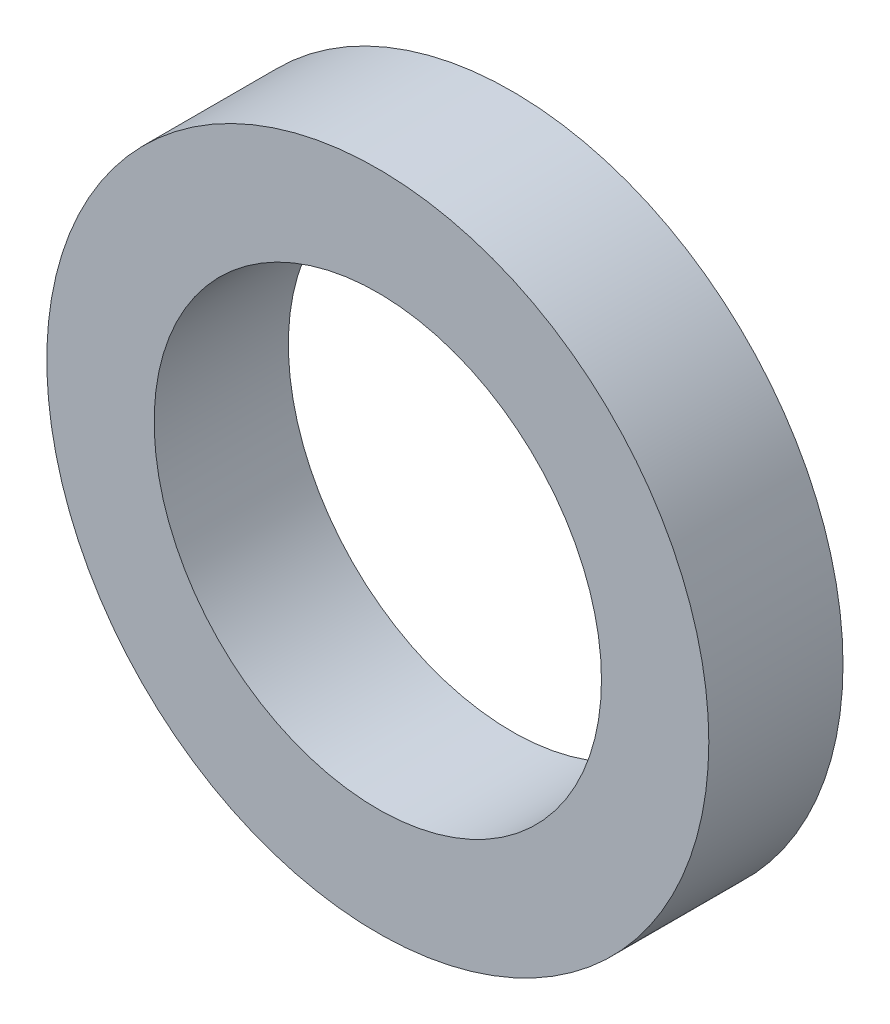
ISO-10303-21;
HEADER;
FILE_DESCRIPTION(('STEP AP214'),'2;1');
FILE_NAME('part.step','',(''),(''),'','','');
FILE_SCHEMA(('AUTOMOTIVE_DESIGN { 1 0 10303 214 1 1 1 1 }'));
ENDSEC;
DATA;
#1=APPLICATION_CONTEXT('core data for automotive mechanical design processes');
#2=APPLICATION_PROTOCOL_DEFINITION('international standard','automotive_design',2000,#1);
#3=PRODUCT_CONTEXT('',#1,'mechanical');
#4=PRODUCT('Part','Part','',(#3));
#5=PRODUCT_RELATED_PRODUCT_CATEGORY('part','',(#4));
#6=PRODUCT_DEFINITION_FORMATION('','',#4);
#7=PRODUCT_DEFINITION_CONTEXT('part definition',#1,'design');
#8=PRODUCT_DEFINITION('design','',#6,#7);
#9=PRODUCT_DEFINITION_SHAPE('','',#8);
#10=(LENGTH_UNIT() NAMED_UNIT(*) SI_UNIT(.MILLI.,.METRE.));
#11=(NAMED_UNIT(*) PLANE_ANGLE_UNIT() SI_UNIT($,.RADIAN.));
#12=(NAMED_UNIT(*) SI_UNIT($,.STERADIAN.) SOLID_ANGLE_UNIT());
#13=UNCERTAINTY_MEASURE_WITH_UNIT(LENGTH_MEASURE(1.E-05),#10,'distance_accuracy_value','');
#14=(GEOMETRIC_REPRESENTATION_CONTEXT(3) GLOBAL_UNCERTAINTY_ASSIGNED_CONTEXT((#13)) GLOBAL_UNIT_ASSIGNED_CONTEXT((#10,
#11,#12)) REPRESENTATION_CONTEXT('',''));
#15=CARTESIAN_POINT('',(0.,0.,0.));
#16=DIRECTION('',(0.,0.,1.));
#17=DIRECTION('',(1.,0.,0.));
#18=AXIS2_PLACEMENT_3D('',#15,#16,#17);
#19=CARTESIAN_POINT('',(0.,0.,1.5));
#20=DIRECTION('',(0.,0.,1.));
#21=DIRECTION('',(1.,0.,0.));
#22=AXIS2_PLACEMENT_3D('',#19,#20,#21);
#23=PLANE('',#22);
#24=CARTESIAN_POINT('',(0.,0.,1.5));
#25=DIRECTION('',(0.,0.,1.));
#26=DIRECTION('',(1.,0.,0.));
#27=AXIS2_PLACEMENT_3D('',#24,#25,#26);
#28=CIRCLE('',#27,3.7);
#29=CARTESIAN_POINT('',(3.7,0.,1.5));
#30=VERTEX_POINT('',#29);
#31=EDGE_CURVE('E10',#30,#30,#28,.T.);
#32=ORIENTED_EDGE('',*,*,#31,.T.);
#33=EDGE_LOOP('',(#32));
#34=FACE_BOUND('',#33,.T.);
#35=CARTESIAN_POINT('',(0.,0.,1.5));
#36=DIRECTION('',(0.,0.,1.));
#37=DIRECTION('',(1.,0.,0.));
#38=AXIS2_PLACEMENT_3D('',#35,#36,#37);
#39=CIRCLE('',#38,2.5);
#40=CARTESIAN_POINT('',(2.5,0.,1.5));
#41=VERTEX_POINT('',#40);
#42=EDGE_CURVE('E54',#41,#41,#39,.T.);
#43=ORIENTED_EDGE('',*,*,#42,.F.);
#44=EDGE_LOOP('',(#43));
#45=FACE_BOUND('',#44,.T.);
#46=ADVANCED_FACE('F41',(#34,#45),#23,.T.);
#47=CARTESIAN_POINT('',(0.,0.,0.));
#48=DIRECTION('',(0.,0.,1.));
#49=DIRECTION('',(1.,0.,0.));
#50=AXIS2_PLACEMENT_3D('',#47,#48,#49);
#51=PLANE('',#50);
#52=CARTESIAN_POINT('',(0.,0.,0.));
#53=DIRECTION('',(0.,0.,1.));
#54=DIRECTION('',(1.,0.,0.));
#55=AXIS2_PLACEMENT_3D('',#52,#53,#54);
#56=CIRCLE('',#55,3.7);
#57=CARTESIAN_POINT('',(3.7,0.,0.));
#58=VERTEX_POINT('',#57);
#59=EDGE_CURVE('E45',#58,#58,#56,.T.);
#60=ORIENTED_EDGE('',*,*,#59,.F.);
#61=EDGE_LOOP('',(#60));
#62=FACE_BOUND('',#61,.T.);
#63=CARTESIAN_POINT('',(0.,0.,0.));
#64=DIRECTION('',(0.,0.,1.));
#65=DIRECTION('',(1.,0.,0.));
#66=AXIS2_PLACEMENT_3D('',#63,#64,#65);
#67=CIRCLE('',#66,2.5);
#68=CARTESIAN_POINT('',(2.5,0.,0.));
#69=VERTEX_POINT('',#68);
#70=EDGE_CURVE('E56',#69,#69,#67,.T.);
#71=ORIENTED_EDGE('',*,*,#70,.T.);
#72=EDGE_LOOP('',(#71));
#73=FACE_BOUND('',#72,.T.);
#74=ADVANCED_FACE('F68',(#62,#73),#51,.F.);
#75=CARTESIAN_POINT('',(0.,0.,1.5));
#76=DIRECTION('',(0.,0.,-1.));
#77=DIRECTION('',(-1.,0.,0.));
#78=AXIS2_PLACEMENT_3D('',#75,#76,#77);
#79=CYLINDRICAL_SURFACE('',#78,3.7);
#80=ORIENTED_EDGE('',*,*,#31,.F.);
#81=EDGE_LOOP('',(#80));
#82=FACE_BOUND('',#81,.T.);
#83=ORIENTED_EDGE('',*,*,#59,.T.);
#84=EDGE_LOOP('',(#83));
#85=FACE_BOUND('',#84,.T.);
#86=ADVANCED_FACE('F43',(#82,#85),#79,.T.);
#87=CARTESIAN_POINT('',(0.,0.,1.5));
#88=DIRECTION('',(0.,0.,-1.));
#89=DIRECTION('',(-1.,0.,0.));
#90=AXIS2_PLACEMENT_3D('',#87,#88,#89);
#91=CYLINDRICAL_SURFACE('',#90,2.5);
#92=ORIENTED_EDGE('',*,*,#42,.T.);
#93=EDGE_LOOP('',(#92));
#94=FACE_BOUND('',#93,.T.);
#95=ORIENTED_EDGE('',*,*,#70,.F.);
#96=EDGE_LOOP('',(#95));
#97=FACE_BOUND('',#96,.T.);
#98=ADVANCED_FACE('F64',(#94,#97),#91,.F.);
#99=CLOSED_SHELL('',(#46,#74,#86,#98));
#100=MANIFOLD_SOLID_BREP('B2',#99);
#101=ADVANCED_BREP_SHAPE_REPRESENTATION('',(#18,#100),#14);
#102=SHAPE_DEFINITION_REPRESENTATION(#9,#101);
ENDSEC;
END-ISO-10303-21;
